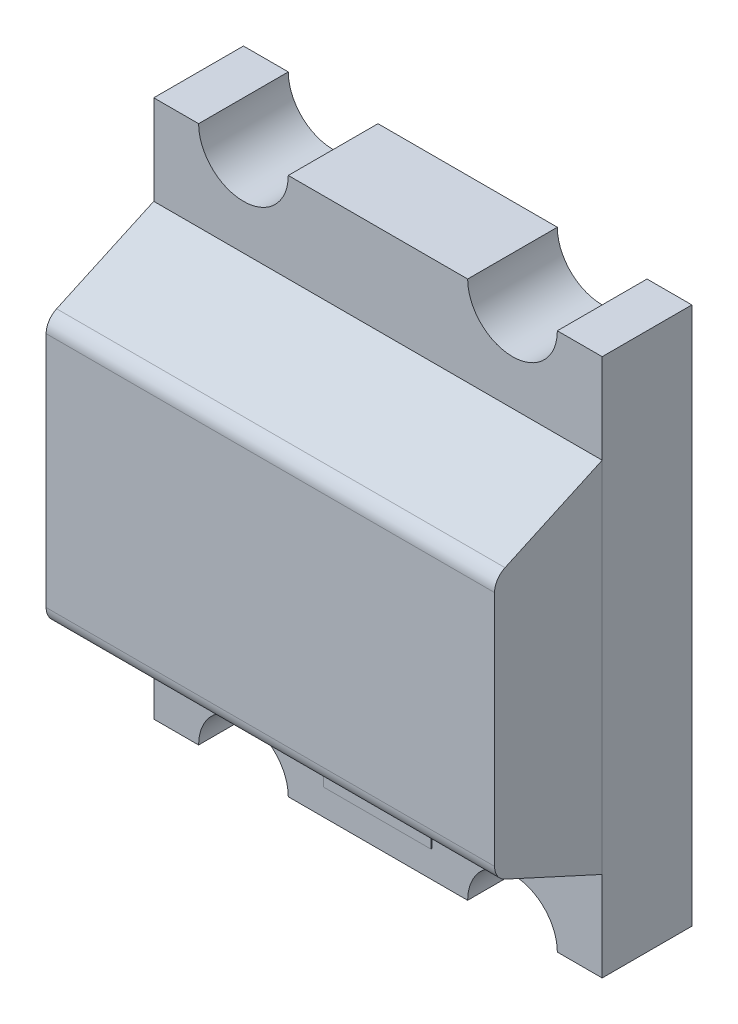
ISO-10303-21;
HEADER;
FILE_DESCRIPTION(('STEP AP214'),'2;1');
FILE_NAME('part.step','',(''),(''),'','','');
FILE_SCHEMA(('AUTOMOTIVE_DESIGN { 1 0 10303 214 1 1 1 1 }'));
ENDSEC;
DATA;
#1=APPLICATION_CONTEXT('core data for automotive mechanical design processes');
#2=APPLICATION_PROTOCOL_DEFINITION('international standard','automotive_design',2000,#1);
#3=PRODUCT_CONTEXT('',#1,'mechanical');
#4=PRODUCT('Part','Part','',(#3));
#5=PRODUCT_RELATED_PRODUCT_CATEGORY('part','',(#4));
#6=PRODUCT_DEFINITION_FORMATION('','',#4);
#7=PRODUCT_DEFINITION_CONTEXT('part definition',#1,'design');
#8=PRODUCT_DEFINITION('design','',#6,#7);
#9=PRODUCT_DEFINITION_SHAPE('','',#8);
#10=(LENGTH_UNIT() NAMED_UNIT(*) SI_UNIT(.MILLI.,.METRE.));
#11=(NAMED_UNIT(*) PLANE_ANGLE_UNIT() SI_UNIT($,.RADIAN.));
#12=(NAMED_UNIT(*) SI_UNIT($,.STERADIAN.) SOLID_ANGLE_UNIT());
#13=UNCERTAINTY_MEASURE_WITH_UNIT(LENGTH_MEASURE(1.E-05),#10,'distance_accuracy_value','');
#14=(GEOMETRIC_REPRESENTATION_CONTEXT(3) GLOBAL_UNCERTAINTY_ASSIGNED_CONTEXT((#13)) GLOBAL_UNIT_ASSIGNED_CONTEXT((#10,
#11,#12)) REPRESENTATION_CONTEXT('',''));
#15=CARTESIAN_POINT('',(0.,0.,0.));
#16=DIRECTION('',(0.,0.,1.));
#17=DIRECTION('',(1.,0.,0.));
#18=AXIS2_PLACEMENT_3D('',#15,#16,#17);
#19=CARTESIAN_POINT('',(0.,0.5,1.1));
#20=DIRECTION('',(0.,0.,1.));
#21=DIRECTION('',(1.,0.,0.));
#22=AXIS2_PLACEMENT_3D('',#19,#20,#21);
#23=PLANE('',#22);
#24=DIRECTION('',(0.,1.,0.));
#25=VECTOR('',#24,1.);
#26=CARTESIAN_POINT('',(2.5,0.5,1.1));
#27=LINE('',#26,#25);
#28=CARTESIAN_POINT('',(2.5,0.838900306603,1.1));
#29=VERTEX_POINT('',#28);
#30=CARTESIAN_POINT('',(2.5,2.161099693397,1.1));
#31=VERTEX_POINT('',#30);
#32=EDGE_CURVE('P0_E101',#29,#31,#27,.T.);
#33=ORIENTED_EDGE('',*,*,#32,.T.);
#34=DIRECTION('',(1.,0.,0.));
#35=VECTOR('',#34,1.);
#36=CARTESIAN_POINT('',(0.,2.161099693397,1.1));
#37=LINE('',#36,#35);
#38=CARTESIAN_POINT('',(0.,2.161099693397,1.1));
#39=VERTEX_POINT('',#38);
#40=EDGE_CURVE('P0_E25',#39,#31,#37,.T.);
#41=ORIENTED_EDGE('',*,*,#40,.F.);
#42=DIRECTION('',(0.,-1.,0.));
#43=VECTOR('',#42,1.);
#44=CARTESIAN_POINT('',(0.,0.5,1.1));
#45=LINE('',#44,#43);
#46=CARTESIAN_POINT('',(0.,0.838900306603,1.1));
#47=VERTEX_POINT('',#46);
#48=EDGE_CURVE('P0_E134',#39,#47,#45,.T.);
#49=ORIENTED_EDGE('',*,*,#48,.T.);
#50=DIRECTION('',(-1.,0.,0.));
#51=VECTOR('',#50,1.);
#52=CARTESIAN_POINT('',(0.,0.838900306603,1.1));
#53=LINE('',#52,#51);
#54=EDGE_CURVE('P0_E11',#29,#47,#53,.T.);
#55=ORIENTED_EDGE('',*,*,#54,.F.);
#56=EDGE_LOOP('',(#33,#41,#49,#55));
#57=FACE_BOUND('',#56,.T.);
#58=ADVANCED_FACE('P0_F17',(#57),#23,.T.);
#59=CARTESIAN_POINT('',(0.,0.838900306603,1.));
#60=DIRECTION('',(1.,0.,0.));
#61=DIRECTION('',(0.,0.,-1.));
#62=AXIS2_PLACEMENT_3D('',#59,#60,#61);
#63=CYLINDRICAL_SURFACE('',#62,0.1);
#64=ORIENTED_EDGE('',*,*,#54,.T.);
#65=CARTESIAN_POINT('',(0.,0.838900306603,1.));
#66=DIRECTION('',(1.,0.,0.));
#67=DIRECTION('',(0.,0.,-1.));
#68=AXIS2_PLACEMENT_3D('',#65,#66,#67);
#69=CIRCLE('',#68,0.1);
#70=CARTESIAN_POINT('',(0.,0.747976695697735,1.04162807922619));
#71=VERTEX_POINT('',#70);
#72=EDGE_CURVE('P0_E137',#47,#71,#69,.T.);
#73=ORIENTED_EDGE('',*,*,#72,.T.);
#74=DIRECTION('',(1.,0.,0.));
#75=VECTOR('',#74,1.);
#76=CARTESIAN_POINT('',(0.,0.747976695697709,1.04162807922613));
#77=LINE('',#76,#75);
#78=CARTESIAN_POINT('',(2.5,0.747976695697892,1.04162807922615));
#79=VERTEX_POINT('',#78);
#80=EDGE_CURVE('P0_E60',#71,#79,#77,.T.);
#81=ORIENTED_EDGE('',*,*,#80,.T.);
#82=CARTESIAN_POINT('',(2.5,0.838900306603,1.));
#83=DIRECTION('',(-1.,0.,0.));
#84=DIRECTION('',(0.,0.,-1.));
#85=AXIS2_PLACEMENT_3D('',#82,#83,#84);
#86=CIRCLE('',#85,0.1);
#87=EDGE_CURVE('P0_E131',#79,#29,#86,.T.);
#88=ORIENTED_EDGE('',*,*,#87,.T.);
#89=EDGE_LOOP('',(#64,#73,#81,#88));
#90=FACE_BOUND('',#89,.T.);
#91=ADVANCED_FACE('P0_F177',(#90),#63,.T.);
#92=CARTESIAN_POINT('',(0.,2.161099693397,1.));
#93=DIRECTION('',(1.,0.,0.));
#94=DIRECTION('',(0.,0.,-1.));
#95=AXIS2_PLACEMENT_3D('',#92,#93,#94);
#96=CYLINDRICAL_SURFACE('',#95,0.1);
#97=DIRECTION('',(1.,0.,0.));
#98=VECTOR('',#97,1.);
#99=CARTESIAN_POINT('',(0.,2.25202330430229,1.04162807922613));
#100=LINE('',#99,#98);
#101=CARTESIAN_POINT('',(0.,2.25202330430227,1.04162807922619));
#102=VERTEX_POINT('',#101);
#103=CARTESIAN_POINT('',(2.5,2.25202330430227,1.04162807922619));
#104=VERTEX_POINT('',#103);
#105=EDGE_CURVE('P0_E96',#102,#104,#100,.T.);
#106=ORIENTED_EDGE('',*,*,#105,.F.);
#107=CARTESIAN_POINT('',(0.,2.161099693397,1.));
#108=DIRECTION('',(1.,0.,0.));
#109=DIRECTION('',(0.,0.,-1.));
#110=AXIS2_PLACEMENT_3D('',#107,#108,#109);
#111=CIRCLE('',#110,0.1);
#112=EDGE_CURVE('P0_E86',#102,#39,#111,.T.);
#113=ORIENTED_EDGE('',*,*,#112,.T.);
#114=ORIENTED_EDGE('',*,*,#40,.T.);
#115=CARTESIAN_POINT('',(2.5,2.161099693397,1.));
#116=DIRECTION('',(1.,0.,0.));
#117=DIRECTION('',(0.,0.,-1.));
#118=AXIS2_PLACEMENT_3D('',#115,#116,#117);
#119=CIRCLE('',#118,0.1);
#120=EDGE_CURVE('P0_E92',#104,#31,#119,.T.);
#121=ORIENTED_EDGE('',*,*,#120,.F.);
#122=EDGE_LOOP('',(#106,#113,#114,#121));
#123=FACE_BOUND('',#122,.T.);
#124=ADVANCED_FACE('P0_F94',(#123),#96,.T.);
#125=CARTESIAN_POINT('',(0.,0.5,0.5));
#126=DIRECTION('',(1.,0.,0.));
#127=DIRECTION('',(0.,1.,0.));
#128=AXIS2_PLACEMENT_3D('',#125,#126,#127);
#129=PLANE('',#128);
#130=DIRECTION('',(0.,-0.416280792260095,0.909236109047209));
#131=VECTOR('',#130,1.);
#132=CARTESIAN_POINT('',(0.,2.5,0.5));
#133=LINE('',#132,#131);
#134=CARTESIAN_POINT('',(0.,2.5,0.5));
#135=VERTEX_POINT('',#134);
#136=EDGE_CURVE('P0_E115',#135,#102,#133,.T.);
#137=ORIENTED_EDGE('',*,*,#136,.F.);
#138=DIRECTION('',(0.,-1.,0.));
#139=VECTOR('',#138,1.);
#140=CARTESIAN_POINT('',(0.,0.5,0.5));
#141=LINE('',#140,#139);
#142=CARTESIAN_POINT('',(0.,0.5,0.5));
#143=VERTEX_POINT('',#142);
#144=EDGE_CURVE('P0_E157',#135,#143,#141,.T.);
#145=ORIENTED_EDGE('',*,*,#144,.T.);
#146=DIRECTION('',(0.,0.416280792260095,0.909236109047209));
#147=VECTOR('',#146,1.);
#148=CARTESIAN_POINT('',(0.,0.5,0.5));
#149=LINE('',#148,#147);
#150=EDGE_CURVE('P0_E126',#143,#71,#149,.T.);
#151=ORIENTED_EDGE('',*,*,#150,.T.);
#152=ORIENTED_EDGE('',*,*,#72,.F.);
#153=ORIENTED_EDGE('',*,*,#48,.F.);
#154=ORIENTED_EDGE('',*,*,#112,.F.);
#155=EDGE_LOOP('',(#137,#145,#151,#152,#153,#154));
#156=FACE_BOUND('',#155,.T.);
#157=ADVANCED_FACE('P0_F168',(#156),#129,.F.);
#158=CARTESIAN_POINT('',(0.,0.5,0.5));
#159=DIRECTION('',(0.,0.909236109047209,-0.416280792260095));
#160=DIRECTION('',(-1.,0.,0.));
#161=AXIS2_PLACEMENT_3D('',#158,#159,#160);
#162=PLANE('',#161);
#163=ORIENTED_EDGE('',*,*,#150,.F.);
#164=DIRECTION('',(1.,0.,0.));
#165=VECTOR('',#164,1.);
#166=CARTESIAN_POINT('',(0.,0.5,0.5));
#167=LINE('',#166,#165);
#168=CARTESIAN_POINT('',(2.5,0.5,0.5));
#169=VERTEX_POINT('',#168);
#170=EDGE_CURVE('P0_E153',#143,#169,#167,.T.);
#171=ORIENTED_EDGE('',*,*,#170,.T.);
#172=DIRECTION('',(0.,-0.416280792260584,-0.909236109046985));
#173=VECTOR('',#172,1.);
#174=CARTESIAN_POINT('',(2.5,0.747976695698,1.041628079226));
#175=LINE('',#174,#173);
#176=EDGE_CURVE('P0_E129',#79,#169,#175,.T.);
#177=ORIENTED_EDGE('',*,*,#176,.F.);
#178=ORIENTED_EDGE('',*,*,#80,.F.);
#179=EDGE_LOOP('',(#163,#171,#177,#178));
#180=FACE_BOUND('',#179,.T.);
#181=ADVANCED_FACE('P0_F173',(#180),#162,.F.);
#182=CARTESIAN_POINT('',(2.5,0.5,0.5));
#183=DIRECTION('',(1.,0.,0.));
#184=DIRECTION('',(0.,1.,0.));
#185=AXIS2_PLACEMENT_3D('',#182,#183,#184);
#186=PLANE('',#185);
#187=DIRECTION('',(0.,0.416280792260095,-0.909236109047209));
#188=VECTOR('',#187,1.);
#189=CARTESIAN_POINT('',(2.5,2.5,0.5));
#190=LINE('',#189,#188);
#191=CARTESIAN_POINT('',(2.5,2.5,0.5));
#192=VERTEX_POINT('',#191);
#193=EDGE_CURVE('P0_E102',#104,#192,#190,.T.);
#194=ORIENTED_EDGE('',*,*,#193,.F.);
#195=ORIENTED_EDGE('',*,*,#120,.T.);
#196=ORIENTED_EDGE('',*,*,#32,.F.);
#197=ORIENTED_EDGE('',*,*,#87,.F.);
#198=ORIENTED_EDGE('',*,*,#176,.T.);
#199=DIRECTION('',(0.,1.,0.));
#200=VECTOR('',#199,1.);
#201=CARTESIAN_POINT('',(2.5,0.5,0.5));
#202=LINE('',#201,#200);
#203=EDGE_CURVE('P0_E108',#169,#192,#202,.T.);
#204=ORIENTED_EDGE('',*,*,#203,.T.);
#205=EDGE_LOOP('',(#194,#195,#196,#197,#198,#204));
#206=FACE_BOUND('',#205,.T.);
#207=ADVANCED_FACE('P0_F105',(#206),#186,.T.);
#208=CARTESIAN_POINT('',(0.,2.5,0.5));
#209=DIRECTION('',(0.,0.909236109047209,0.416280792260095));
#210=DIRECTION('',(1.,0.,0.));
#211=AXIS2_PLACEMENT_3D('',#208,#209,#210);
#212=PLANE('',#211);
#213=ORIENTED_EDGE('',*,*,#136,.T.);
#214=ORIENTED_EDGE('',*,*,#105,.T.);
#215=ORIENTED_EDGE('',*,*,#193,.T.);
#216=DIRECTION('',(-1.,0.,0.));
#217=VECTOR('',#216,1.);
#218=CARTESIAN_POINT('',(0.,2.5,0.5));
#219=LINE('',#218,#217);
#220=EDGE_CURVE('P0_E122',#192,#135,#219,.T.);
#221=ORIENTED_EDGE('',*,*,#220,.T.);
#222=EDGE_LOOP('',(#213,#214,#215,#221));
#223=FACE_BOUND('',#222,.T.);
#224=ADVANCED_FACE('P0_F114',(#223),#212,.T.);
#225=CARTESIAN_POINT('',(0.,0.5,0.5));
#226=DIRECTION('',(0.,0.,1.));
#227=DIRECTION('',(1.,0.,0.));
#228=AXIS2_PLACEMENT_3D('',#225,#226,#227);
#229=PLANE('',#228);
#230=ORIENTED_EDGE('',*,*,#203,.F.);
#231=ORIENTED_EDGE('',*,*,#170,.F.);
#232=ORIENTED_EDGE('',*,*,#144,.F.);
#233=ORIENTED_EDGE('',*,*,#220,.F.);
#234=EDGE_LOOP('',(#230,#231,#232,#233));
#235=FACE_BOUND('',#234,.T.);
#236=ADVANCED_FACE('P0_F171',(#235),#229,.F.);
#237=CLOSED_SHELL('',(#58,#91,#124,#157,#181,#207,#224,#236));
#238=MANIFOLD_SOLID_BREP('P0_B1',#237);
#239=CARTESIAN_POINT('',(0.,0.,0.));
#240=DIRECTION('',(0.,0.,1.));
#241=DIRECTION('',(1.,0.,0.));
#242=AXIS2_PLACEMENT_3D('',#239,#240,#241);
#243=PLANE('',#242);
#244=DIRECTION('',(-1.,0.,0.));
#245=VECTOR('',#244,1.);
#246=CARTESIAN_POINT('',(0.,3.,0.));
#247=LINE('',#246,#245);
#248=CARTESIAN_POINT('',(1.75,3.,0.));
#249=VERTEX_POINT('',#248);
#250=CARTESIAN_POINT('',(0.75,3.,0.));
#251=VERTEX_POINT('',#250);
#252=EDGE_CURVE('P1_E156',#249,#251,#247,.T.);
#253=ORIENTED_EDGE('',*,*,#252,.F.);
#254=CARTESIAN_POINT('',(2.,3.,0.));
#255=DIRECTION('',(0.,0.,-1.));
#256=DIRECTION('',(1.,0.,0.));
#257=AXIS2_PLACEMENT_3D('',#254,#255,#256);
#258=CIRCLE('',#257,0.25);
#259=CARTESIAN_POINT('',(2.25,3.,0.));
#260=VERTEX_POINT('',#259);
#261=EDGE_CURVE('P1_E148',#260,#249,#258,.T.);
#262=ORIENTED_EDGE('',*,*,#261,.F.);
#263=DIRECTION('',(-1.,0.,0.));
#264=VECTOR('',#263,1.);
#265=CARTESIAN_POINT('',(0.,3.,0.));
#266=LINE('',#265,#264);
#267=CARTESIAN_POINT('',(2.5,3.,0.));
#268=VERTEX_POINT('',#267);
#269=EDGE_CURVE('P1_E133',#268,#260,#266,.T.);
#270=ORIENTED_EDGE('',*,*,#269,.F.);
#271=DIRECTION('',(0.,1.,0.));
#272=VECTOR('',#271,1.);
#273=CARTESIAN_POINT('',(2.5,0.,0.));
#274=LINE('',#273,#272);
#275=CARTESIAN_POINT('',(2.5,0.,0.));
#276=VERTEX_POINT('',#275);
#277=EDGE_CURVE('P1_E173',#276,#268,#274,.T.);
#278=ORIENTED_EDGE('',*,*,#277,.F.);
#279=DIRECTION('',(-1.,0.,0.));
#280=VECTOR('',#279,1.);
#281=CARTESIAN_POINT('',(0.,0.,0.));
#282=LINE('',#281,#280);
#283=CARTESIAN_POINT('',(2.25,0.,0.));
#284=VERTEX_POINT('',#283);
#285=EDGE_CURVE('P1_E183',#276,#284,#282,.T.);
#286=ORIENTED_EDGE('',*,*,#285,.T.);
#287=CARTESIAN_POINT('',(2.,0.,0.));
#288=DIRECTION('',(0.,0.,1.));
#289=DIRECTION('',(1.,0.,0.));
#290=AXIS2_PLACEMENT_3D('',#287,#288,#289);
#291=CIRCLE('',#290,0.25);
#292=CARTESIAN_POINT('',(1.75,0.,0.));
#293=VERTEX_POINT('',#292);
#294=EDGE_CURVE('P1_E187',#284,#293,#291,.T.);
#295=ORIENTED_EDGE('',*,*,#294,.T.);
#296=DIRECTION('',(-1.,0.,0.));
#297=VECTOR('',#296,1.);
#298=CARTESIAN_POINT('',(0.,0.,0.));
#299=LINE('',#298,#297);
#300=CARTESIAN_POINT('',(0.75,0.,0.));
#301=VERTEX_POINT('',#300);
#302=EDGE_CURVE('P1_E182',#293,#301,#299,.T.);
#303=ORIENTED_EDGE('',*,*,#302,.T.);
#304=CARTESIAN_POINT('',(0.5,0.,0.));
#305=DIRECTION('',(0.,0.,1.));
#306=DIRECTION('',(1.,0.,0.));
#307=AXIS2_PLACEMENT_3D('',#304,#305,#306);
#308=CIRCLE('',#307,0.25);
#309=CARTESIAN_POINT('',(0.25,0.,0.));
#310=VERTEX_POINT('',#309);
#311=EDGE_CURVE('P1_E177',#301,#310,#308,.T.);
#312=ORIENTED_EDGE('',*,*,#311,.T.);
#313=DIRECTION('',(-1.,0.,0.));
#314=VECTOR('',#313,1.);
#315=CARTESIAN_POINT('',(0.,0.,0.));
#316=LINE('',#315,#314);
#317=CARTESIAN_POINT('',(0.,0.,0.));
#318=VERTEX_POINT('',#317);
#319=EDGE_CURVE('P1_E201',#310,#318,#316,.T.);
#320=ORIENTED_EDGE('',*,*,#319,.T.);
#321=DIRECTION('',(0.,1.,0.));
#322=VECTOR('',#321,1.);
#323=CARTESIAN_POINT('',(0.,0.,0.));
#324=LINE('',#323,#322);
#325=CARTESIAN_POINT('',(0.,3.,0.));
#326=VERTEX_POINT('',#325);
#327=EDGE_CURVE('P1_E25',#318,#326,#324,.T.);
#328=ORIENTED_EDGE('',*,*,#327,.T.);
#329=DIRECTION('',(-1.,0.,0.));
#330=VECTOR('',#329,1.);
#331=CARTESIAN_POINT('',(0.,3.,0.));
#332=LINE('',#331,#330);
#333=CARTESIAN_POINT('',(0.25,3.,0.));
#334=VERTEX_POINT('',#333);
#335=EDGE_CURVE('P1_E10',#334,#326,#332,.T.);
#336=ORIENTED_EDGE('',*,*,#335,.F.);
#337=CARTESIAN_POINT('',(0.5,3.,0.));
#338=DIRECTION('',(0.,0.,-1.));
#339=DIRECTION('',(1.,0.,0.));
#340=AXIS2_PLACEMENT_3D('',#337,#338,#339);
#341=CIRCLE('',#340,0.25);
#342=EDGE_CURVE('P1_E272',#251,#334,#341,.T.);
#343=ORIENTED_EDGE('',*,*,#342,.F.);
#344=EDGE_LOOP('',(#253,#262,#270,#278,#286,#295,#303,#312,#320,#328,#336,#343));
#345=FACE_BOUND('',#344,.T.);
#346=ADVANCED_FACE('P1_F16',(#345),#243,.F.);
#347=CARTESIAN_POINT('',(0.,3.,0.));
#348=DIRECTION('',(0.,1.,0.));
#349=DIRECTION('',(1.,0.,0.));
#350=AXIS2_PLACEMENT_3D('',#347,#348,#349);
#351=PLANE('',#350);
#352=DIRECTION('',(-1.,0.,0.));
#353=VECTOR('',#352,1.);
#354=CARTESIAN_POINT('',(0.,3.,0.5));
#355=LINE('',#354,#353);
#356=CARTESIAN_POINT('',(0.25,3.,0.5));
#357=VERTEX_POINT('',#356);
#358=CARTESIAN_POINT('',(0.,3.,0.5));
#359=VERTEX_POINT('',#358);
#360=EDGE_CURVE('P1_E216',#357,#359,#355,.T.);
#361=ORIENTED_EDGE('',*,*,#360,.F.);
#362=DIRECTION('',(0.,0.,-1.));
#363=VECTOR('',#362,1.);
#364=CARTESIAN_POINT('',(0.25,3.,0.5));
#365=LINE('',#364,#363);
#366=EDGE_CURVE('P1_E218',#357,#334,#365,.T.);
#367=ORIENTED_EDGE('',*,*,#366,.T.);
#368=ORIENTED_EDGE('',*,*,#335,.T.);
#369=DIRECTION('',(0.,0.,1.));
#370=VECTOR('',#369,1.);
#371=CARTESIAN_POINT('',(0.,3.,0.));
#372=LINE('',#371,#370);
#373=EDGE_CURVE('P1_E204',#326,#359,#372,.T.);
#374=ORIENTED_EDGE('',*,*,#373,.T.);
#375=EDGE_LOOP('',(#361,#367,#368,#374));
#376=FACE_BOUND('',#375,.T.);
#377=ADVANCED_FACE('P1_F215',(#376),#351,.T.);
#378=CARTESIAN_POINT('',(0.,0.,0.));
#379=DIRECTION('',(1.,0.,0.));
#380=DIRECTION('',(0.,1.,0.));
#381=AXIS2_PLACEMENT_3D('',#378,#379,#380);
#382=PLANE('',#381);
#383=ORIENTED_EDGE('',*,*,#373,.F.);
#384=ORIENTED_EDGE('',*,*,#327,.F.);
#385=DIRECTION('',(0.,0.,1.));
#386=VECTOR('',#385,1.);
#387=CARTESIAN_POINT('',(0.,0.,0.));
#388=LINE('',#387,#386);
#389=CARTESIAN_POINT('',(0.,0.,0.5));
#390=VERTEX_POINT('',#389);
#391=EDGE_CURVE('P1_E200',#318,#390,#388,.T.);
#392=ORIENTED_EDGE('',*,*,#391,.T.);
#393=DIRECTION('',(0.,-1.,0.));
#394=VECTOR('',#393,1.);
#395=CARTESIAN_POINT('',(0.,0.,0.5));
#396=LINE('',#395,#394);
#397=EDGE_CURVE('P1_E212',#359,#390,#396,.T.);
#398=ORIENTED_EDGE('',*,*,#397,.F.);
#399=EDGE_LOOP('',(#383,#384,#392,#398));
#400=FACE_BOUND('',#399,.T.);
#401=ADVANCED_FACE('P1_F18',(#400),#382,.F.);
#402=CARTESIAN_POINT('',(0.,0.,0.));
#403=DIRECTION('',(0.,1.,0.));
#404=DIRECTION('',(1.,0.,0.));
#405=AXIS2_PLACEMENT_3D('',#402,#403,#404);
#406=PLANE('',#405);
#407=DIRECTION('',(1.,0.,0.));
#408=VECTOR('',#407,1.);
#409=CARTESIAN_POINT('',(0.,0.,0.5));
#410=LINE('',#409,#408);
#411=CARTESIAN_POINT('',(0.25,0.,0.5));
#412=VERTEX_POINT('',#411);
#413=EDGE_CURVE('P1_E239',#390,#412,#410,.T.);
#414=ORIENTED_EDGE('',*,*,#413,.F.);
#415=ORIENTED_EDGE('',*,*,#391,.F.);
#416=ORIENTED_EDGE('',*,*,#319,.F.);
#417=DIRECTION('',(0.,0.,1.));
#418=VECTOR('',#417,1.);
#419=CARTESIAN_POINT('',(0.25,0.,0.5));
#420=LINE('',#419,#418);
#421=EDGE_CURVE('P1_E181',#310,#412,#420,.T.);
#422=ORIENTED_EDGE('',*,*,#421,.T.);
#423=EDGE_LOOP('',(#414,#415,#416,#422));
#424=FACE_BOUND('',#423,.T.);
#425=ADVANCED_FACE('P1_F297',(#424),#406,.F.);
#426=CARTESIAN_POINT('',(0.5,0.,0.5));
#427=DIRECTION('',(0.,0.,1.));
#428=DIRECTION('',(1.,0.,0.));
#429=AXIS2_PLACEMENT_3D('',#426,#427,#428);
#430=CYLINDRICAL_SURFACE('',#429,0.25);
#431=ORIENTED_EDGE('',*,*,#311,.F.);
#432=DIRECTION('',(0.,0.,1.));
#433=VECTOR('',#432,1.);
#434=CARTESIAN_POINT('',(0.75,0.,0.));
#435=LINE('',#434,#433);
#436=CARTESIAN_POINT('',(0.75,0.,0.5));
#437=VERTEX_POINT('',#436);
#438=EDGE_CURVE('P1_E194',#301,#437,#435,.T.);
#439=ORIENTED_EDGE('',*,*,#438,.T.);
#440=CARTESIAN_POINT('',(0.5,0.,0.5));
#441=DIRECTION('',(0.,0.,-1.));
#442=DIRECTION('',(1.,0.,0.));
#443=AXIS2_PLACEMENT_3D('',#440,#441,#442);
#444=CIRCLE('',#443,0.25);
#445=EDGE_CURVE('P1_E250',#412,#437,#444,.T.);
#446=ORIENTED_EDGE('',*,*,#445,.F.);
#447=ORIENTED_EDGE('',*,*,#421,.F.);
#448=EDGE_LOOP('',(#431,#439,#446,#447));
#449=FACE_BOUND('',#448,.T.);
#450=ADVANCED_FACE('P1_F300',(#449),#430,.F.);
#451=CARTESIAN_POINT('',(0.,0.,0.));
#452=DIRECTION('',(0.,1.,0.));
#453=DIRECTION('',(1.,0.,0.));
#454=AXIS2_PLACEMENT_3D('',#451,#452,#453);
#455=PLANE('',#454);
#456=DIRECTION('',(1.,0.,0.));
#457=VECTOR('',#456,1.);
#458=CARTESIAN_POINT('',(0.,0.,0.5));
#459=LINE('',#458,#457);
#460=CARTESIAN_POINT('',(1.75,0.,0.5));
#461=VERTEX_POINT('',#460);
#462=EDGE_CURVE('P1_E245',#437,#461,#459,.T.);
#463=ORIENTED_EDGE('',*,*,#462,.F.);
#464=ORIENTED_EDGE('',*,*,#438,.F.);
#465=ORIENTED_EDGE('',*,*,#302,.F.);
#466=DIRECTION('',(0.,0.,1.));
#467=VECTOR('',#466,1.);
#468=CARTESIAN_POINT('',(1.75,0.,0.5));
#469=LINE('',#468,#467);
#470=EDGE_CURVE('P1_E191',#293,#461,#469,.T.);
#471=ORIENTED_EDGE('',*,*,#470,.T.);
#472=EDGE_LOOP('',(#463,#464,#465,#471));
#473=FACE_BOUND('',#472,.T.);
#474=ADVANCED_FACE('P1_F304',(#473),#455,.F.);
#475=CARTESIAN_POINT('',(2.,0.,0.5));
#476=DIRECTION('',(0.,0.,1.));
#477=DIRECTION('',(1.,0.,0.));
#478=AXIS2_PLACEMENT_3D('',#475,#476,#477);
#479=CYLINDRICAL_SURFACE('',#478,0.25);
#480=ORIENTED_EDGE('',*,*,#294,.F.);
#481=DIRECTION('',(0.,0.,1.));
#482=VECTOR('',#481,1.);
#483=CARTESIAN_POINT('',(2.25,0.,0.));
#484=LINE('',#483,#482);
#485=CARTESIAN_POINT('',(2.25,0.,0.5));
#486=VERTEX_POINT('',#485);
#487=EDGE_CURVE('P1_E176',#284,#486,#484,.T.);
#488=ORIENTED_EDGE('',*,*,#487,.T.);
#489=CARTESIAN_POINT('',(2.,0.,0.5));
#490=DIRECTION('',(0.,0.,-1.));
#491=DIRECTION('',(1.,0.,0.));
#492=AXIS2_PLACEMENT_3D('',#489,#490,#491);
#493=CIRCLE('',#492,0.25);
#494=EDGE_CURVE('P1_E249',#461,#486,#493,.T.);
#495=ORIENTED_EDGE('',*,*,#494,.F.);
#496=ORIENTED_EDGE('',*,*,#470,.F.);
#497=EDGE_LOOP('',(#480,#488,#495,#496));
#498=FACE_BOUND('',#497,.T.);
#499=ADVANCED_FACE('P1_F309',(#498),#479,.F.);
#500=CARTESIAN_POINT('',(0.,0.,0.));
#501=DIRECTION('',(0.,1.,0.));
#502=DIRECTION('',(1.,0.,0.));
#503=AXIS2_PLACEMENT_3D('',#500,#501,#502);
#504=PLANE('',#503);
#505=DIRECTION('',(1.,0.,0.));
#506=VECTOR('',#505,1.);
#507=CARTESIAN_POINT('',(0.,0.,0.5));
#508=LINE('',#507,#506);
#509=CARTESIAN_POINT('',(2.5,0.,0.5));
#510=VERTEX_POINT('',#509);
#511=EDGE_CURVE('P1_E254',#486,#510,#508,.T.);
#512=ORIENTED_EDGE('',*,*,#511,.F.);
#513=ORIENTED_EDGE('',*,*,#487,.F.);
#514=ORIENTED_EDGE('',*,*,#285,.F.);
#515=DIRECTION('',(0.,0.,-1.));
#516=VECTOR('',#515,1.);
#517=CARTESIAN_POINT('',(2.5,0.,0.));
#518=LINE('',#517,#516);
#519=EDGE_CURVE('P1_E144',#510,#276,#518,.T.);
#520=ORIENTED_EDGE('',*,*,#519,.F.);
#521=EDGE_LOOP('',(#512,#513,#514,#520));
#522=FACE_BOUND('',#521,.T.);
#523=ADVANCED_FACE('P1_F312',(#522),#504,.F.);
#524=CARTESIAN_POINT('',(2.5,0.,0.));
#525=DIRECTION('',(1.,0.,0.));
#526=DIRECTION('',(0.,1.,0.));
#527=AXIS2_PLACEMENT_3D('',#524,#525,#526);
#528=PLANE('',#527);
#529=DIRECTION('',(0.,0.,-1.));
#530=VECTOR('',#529,1.);
#531=CARTESIAN_POINT('',(2.5,3.,0.));
#532=LINE('',#531,#530);
#533=CARTESIAN_POINT('',(2.5,3.,0.5));
#534=VERTEX_POINT('',#533);
#535=EDGE_CURVE('P1_E139',#534,#268,#532,.T.);
#536=ORIENTED_EDGE('',*,*,#535,.F.);
#537=DIRECTION('',(0.,1.,0.));
#538=VECTOR('',#537,1.);
#539=CARTESIAN_POINT('',(2.5,0.,0.5));
#540=LINE('',#539,#538);
#541=EDGE_CURVE('P1_E260',#510,#534,#540,.T.);
#542=ORIENTED_EDGE('',*,*,#541,.F.);
#543=ORIENTED_EDGE('',*,*,#519,.T.);
#544=ORIENTED_EDGE('',*,*,#277,.T.);
#545=EDGE_LOOP('',(#536,#542,#543,#544));
#546=FACE_BOUND('',#545,.T.);
#547=ADVANCED_FACE('P1_F315',(#546),#528,.T.);
#548=CARTESIAN_POINT('',(0.,3.,0.));
#549=DIRECTION('',(0.,1.,0.));
#550=DIRECTION('',(1.,0.,0.));
#551=AXIS2_PLACEMENT_3D('',#548,#549,#550);
#552=PLANE('',#551);
#553=DIRECTION('',(-1.,0.,0.));
#554=VECTOR('',#553,1.);
#555=CARTESIAN_POINT('',(0.,3.,0.5));
#556=LINE('',#555,#554);
#557=CARTESIAN_POINT('',(2.25,3.,0.5));
#558=VERTEX_POINT('',#557);
#559=EDGE_CURVE('P1_E257',#534,#558,#556,.T.);
#560=ORIENTED_EDGE('',*,*,#559,.F.);
#561=ORIENTED_EDGE('',*,*,#535,.T.);
#562=ORIENTED_EDGE('',*,*,#269,.T.);
#563=DIRECTION('',(0.,0.,1.));
#564=VECTOR('',#563,1.);
#565=CARTESIAN_POINT('',(2.25,3.,0.5));
#566=LINE('',#565,#564);
#567=EDGE_CURVE('P1_E137',#260,#558,#566,.T.);
#568=ORIENTED_EDGE('',*,*,#567,.T.);
#569=EDGE_LOOP('',(#560,#561,#562,#568));
#570=FACE_BOUND('',#569,.T.);
#571=ADVANCED_FACE('P1_F136',(#570),#552,.T.);
#572=CARTESIAN_POINT('',(2.,3.,0.5));
#573=DIRECTION('',(0.,0.,1.));
#574=DIRECTION('',(1.,0.,0.));
#575=AXIS2_PLACEMENT_3D('',#572,#573,#574);
#576=CYLINDRICAL_SURFACE('',#575,0.25);
#577=ORIENTED_EDGE('',*,*,#261,.T.);
#578=DIRECTION('',(0.,0.,-1.));
#579=VECTOR('',#578,1.);
#580=CARTESIAN_POINT('',(1.75,3.,0.));
#581=LINE('',#580,#579);
#582=CARTESIAN_POINT('',(1.75,3.,0.5));
#583=VERTEX_POINT('',#582);
#584=EDGE_CURVE('P1_E164',#583,#249,#581,.T.);
#585=ORIENTED_EDGE('',*,*,#584,.F.);
#586=CARTESIAN_POINT('',(2.,3.,0.5));
#587=DIRECTION('',(0.,0.,-1.));
#588=DIRECTION('',(1.,0.,0.));
#589=AXIS2_PLACEMENT_3D('',#586,#587,#588);
#590=CIRCLE('',#589,0.25);
#591=EDGE_CURVE('P1_E151',#558,#583,#590,.T.);
#592=ORIENTED_EDGE('',*,*,#591,.F.);
#593=ORIENTED_EDGE('',*,*,#567,.F.);
#594=EDGE_LOOP('',(#577,#585,#592,#593));
#595=FACE_BOUND('',#594,.T.);
#596=ADVANCED_FACE('P1_F147',(#595),#576,.F.);
#597=CARTESIAN_POINT('',(0.,3.,0.));
#598=DIRECTION('',(0.,1.,0.));
#599=DIRECTION('',(1.,0.,0.));
#600=AXIS2_PLACEMENT_3D('',#597,#598,#599);
#601=PLANE('',#600);
#602=DIRECTION('',(-1.,0.,0.));
#603=VECTOR('',#602,1.);
#604=CARTESIAN_POINT('',(0.,3.,0.5));
#605=LINE('',#604,#603);
#606=CARTESIAN_POINT('',(0.75,3.,0.5));
#607=VERTEX_POINT('',#606);
#608=EDGE_CURVE('P1_E228',#583,#607,#605,.T.);
#609=ORIENTED_EDGE('',*,*,#608,.F.);
#610=ORIENTED_EDGE('',*,*,#584,.T.);
#611=ORIENTED_EDGE('',*,*,#252,.T.);
#612=DIRECTION('',(0.,0.,1.));
#613=VECTOR('',#612,1.);
#614=CARTESIAN_POINT('',(0.75,3.,0.5));
#615=LINE('',#614,#613);
#616=EDGE_CURVE('P1_E266',#251,#607,#615,.T.);
#617=ORIENTED_EDGE('',*,*,#616,.T.);
#618=EDGE_LOOP('',(#609,#610,#611,#617));
#619=FACE_BOUND('',#618,.T.);
#620=ADVANCED_FACE('P1_F278',(#619),#601,.T.);
#621=CARTESIAN_POINT('',(0.5,3.,0.5));
#622=DIRECTION('',(0.,0.,1.));
#623=DIRECTION('',(1.,0.,0.));
#624=AXIS2_PLACEMENT_3D('',#621,#622,#623);
#625=CYLINDRICAL_SURFACE('',#624,0.25);
#626=ORIENTED_EDGE('',*,*,#342,.T.);
#627=ORIENTED_EDGE('',*,*,#366,.F.);
#628=CARTESIAN_POINT('',(0.5,3.,0.5));
#629=DIRECTION('',(0.,0.,-1.));
#630=DIRECTION('',(1.,0.,0.));
#631=AXIS2_PLACEMENT_3D('',#628,#629,#630);
#632=CIRCLE('',#631,0.25);
#633=EDGE_CURVE('P1_E222',#607,#357,#632,.T.);
#634=ORIENTED_EDGE('',*,*,#633,.F.);
#635=ORIENTED_EDGE('',*,*,#616,.F.);
#636=EDGE_LOOP('',(#626,#627,#634,#635));
#637=FACE_BOUND('',#636,.T.);
#638=ADVANCED_FACE('P1_F279',(#637),#625,.F.);
#639=CARTESIAN_POINT('',(0.,0.,0.5));
#640=DIRECTION('',(0.,0.,1.));
#641=DIRECTION('',(1.,0.,0.));
#642=AXIS2_PLACEMENT_3D('',#639,#640,#641);
#643=PLANE('',#642);
#644=ORIENTED_EDGE('',*,*,#608,.T.);
#645=ORIENTED_EDGE('',*,*,#633,.T.);
#646=ORIENTED_EDGE('',*,*,#360,.T.);
#647=ORIENTED_EDGE('',*,*,#397,.T.);
#648=ORIENTED_EDGE('',*,*,#413,.T.);
#649=ORIENTED_EDGE('',*,*,#445,.T.);
#650=ORIENTED_EDGE('',*,*,#462,.T.);
#651=ORIENTED_EDGE('',*,*,#494,.T.);
#652=ORIENTED_EDGE('',*,*,#511,.T.);
#653=ORIENTED_EDGE('',*,*,#541,.T.);
#654=ORIENTED_EDGE('',*,*,#559,.T.);
#655=ORIENTED_EDGE('',*,*,#591,.T.);
#656=EDGE_LOOP('',(#644,#645,#646,#647,#648,#649,#650,#651,#652,#653,#654,#655));
#657=FACE_BOUND('',#656,.T.);
#658=ADVANCED_FACE('P1_F226',(#657),#643,.T.);
#659=CLOSED_SHELL('',(#346,#377,#401,#425,#450,#474,#499,#523,#547,#571,#596,#620,#638,#658));
#660=MANIFOLD_SOLID_BREP('P1_B1',#659);
#661=CARTESIAN_POINT('',(0.95,0.15,0.505));
#662=DIRECTION('',(0.,0.,1.));
#663=DIRECTION('',(1.,0.,0.));
#664=AXIS2_PLACEMENT_3D('',#661,#662,#663);
#665=PLANE('',#664);
#666=DIRECTION('',(0.,-1.,0.));
#667=VECTOR('',#666,1.);
#668=CARTESIAN_POINT('',(1.55,0.15,0.505));
#669=LINE('',#668,#667);
#670=CARTESIAN_POINT('',(1.55,0.5,0.505));
#671=VERTEX_POINT('',#670);
#672=CARTESIAN_POINT('',(1.55,0.15,0.505));
#673=VERTEX_POINT('',#672);
#674=EDGE_CURVE('P2_E75',#671,#673,#669,.T.);
#675=ORIENTED_EDGE('',*,*,#674,.F.);
#676=DIRECTION('',(1.,0.,0.));
#677=VECTOR('',#676,1.);
#678=CARTESIAN_POINT('',(0.95,0.5,0.505));
#679=LINE('',#678,#677);
#680=CARTESIAN_POINT('',(0.95,0.5,0.505));
#681=VERTEX_POINT('',#680);
#682=EDGE_CURVE('P2_E104',#681,#671,#679,.T.);
#683=ORIENTED_EDGE('',*,*,#682,.F.);
#684=DIRECTION('',(0.,-1.,0.));
#685=VECTOR('',#684,1.);
#686=CARTESIAN_POINT('',(0.95,0.15,0.505));
#687=LINE('',#686,#685);
#688=CARTESIAN_POINT('',(0.95,0.15,0.505));
#689=VERTEX_POINT('',#688);
#690=EDGE_CURVE('P2_E11',#681,#689,#687,.T.);
#691=ORIENTED_EDGE('',*,*,#690,.T.);
#692=DIRECTION('',(1.,0.,0.));
#693=VECTOR('',#692,1.);
#694=CARTESIAN_POINT('',(0.95,0.15,0.505));
#695=LINE('',#694,#693);
#696=EDGE_CURVE('P2_E42',#689,#673,#695,.T.);
#697=ORIENTED_EDGE('',*,*,#696,.T.);
#698=EDGE_LOOP('',(#675,#683,#691,#697));
#699=FACE_BOUND('',#698,.T.);
#700=ADVANCED_FACE('P2_F17',(#699),#665,.T.);
#701=CARTESIAN_POINT('',(0.95,0.15,0.5));
#702=DIRECTION('',(1.,0.,0.));
#703=DIRECTION('',(0.,1.,0.));
#704=AXIS2_PLACEMENT_3D('',#701,#702,#703);
#705=PLANE('',#704);
#706=DIRECTION('',(0.,0.,1.));
#707=VECTOR('',#706,1.);
#708=CARTESIAN_POINT('',(0.95,0.5,0.5));
#709=LINE('',#708,#707);
#710=CARTESIAN_POINT('',(0.95,0.5,0.5));
#711=VERTEX_POINT('',#710);
#712=EDGE_CURVE('P2_E111',#711,#681,#709,.T.);
#713=ORIENTED_EDGE('',*,*,#712,.F.);
#714=DIRECTION('',(0.,-1.,0.));
#715=VECTOR('',#714,1.);
#716=CARTESIAN_POINT('',(0.95,0.15,0.5));
#717=LINE('',#716,#715);
#718=CARTESIAN_POINT('',(0.95,0.15,0.5));
#719=VERTEX_POINT('',#718);
#720=EDGE_CURVE('P2_E86',#711,#719,#717,.T.);
#721=ORIENTED_EDGE('',*,*,#720,.T.);
#722=DIRECTION('',(0.,0.,1.));
#723=VECTOR('',#722,1.);
#724=CARTESIAN_POINT('',(0.95,0.15,0.5));
#725=LINE('',#724,#723);
#726=EDGE_CURVE('P2_E25',#719,#689,#725,.T.);
#727=ORIENTED_EDGE('',*,*,#726,.T.);
#728=ORIENTED_EDGE('',*,*,#690,.F.);
#729=EDGE_LOOP('',(#713,#721,#727,#728));
#730=FACE_BOUND('',#729,.T.);
#731=ADVANCED_FACE('P2_F191',(#730),#705,.F.);
#732=CARTESIAN_POINT('',(0.95,0.15,0.5));
#733=DIRECTION('',(0.,1.,0.));
#734=DIRECTION('',(1.,0.,0.));
#735=AXIS2_PLACEMENT_3D('',#732,#733,#734);
#736=PLANE('',#735);
#737=ORIENTED_EDGE('',*,*,#696,.F.);
#738=ORIENTED_EDGE('',*,*,#726,.F.);
#739=DIRECTION('',(1.,0.,0.));
#740=VECTOR('',#739,1.);
#741=CARTESIAN_POINT('',(0.95,0.15,0.5));
#742=LINE('',#741,#740);
#743=CARTESIAN_POINT('',(1.55,0.15,0.5));
#744=VERTEX_POINT('',#743);
#745=EDGE_CURVE('P2_E80',#719,#744,#742,.T.);
#746=ORIENTED_EDGE('',*,*,#745,.T.);
#747=DIRECTION('',(0.,0.,-1.));
#748=VECTOR('',#747,1.);
#749=CARTESIAN_POINT('',(1.55,0.15,0.5));
#750=LINE('',#749,#748);
#751=EDGE_CURVE('P2_E69',#673,#744,#750,.T.);
#752=ORIENTED_EDGE('',*,*,#751,.F.);
#753=EDGE_LOOP('',(#737,#738,#746,#752));
#754=FACE_BOUND('',#753,.T.);
#755=ADVANCED_FACE('P2_F81',(#754),#736,.F.);
#756=CARTESIAN_POINT('',(1.55,0.15,0.5));
#757=DIRECTION('',(1.,0.,0.));
#758=DIRECTION('',(0.,1.,0.));
#759=AXIS2_PLACEMENT_3D('',#756,#757,#758);
#760=PLANE('',#759);
#761=DIRECTION('',(0.,0.,-1.));
#762=VECTOR('',#761,1.);
#763=CARTESIAN_POINT('',(1.55,0.5,0.5));
#764=LINE('',#763,#762);
#765=CARTESIAN_POINT('',(1.55,0.5,0.5));
#766=VERTEX_POINT('',#765);
#767=EDGE_CURVE('P2_E108',#671,#766,#764,.T.);
#768=ORIENTED_EDGE('',*,*,#767,.F.);
#769=ORIENTED_EDGE('',*,*,#674,.T.);
#770=ORIENTED_EDGE('',*,*,#751,.T.);
#771=DIRECTION('',(0.,1.,0.));
#772=VECTOR('',#771,1.);
#773=CARTESIAN_POINT('',(1.55,0.15,0.5));
#774=LINE('',#773,#772);
#775=EDGE_CURVE('P2_E74',#744,#766,#774,.T.);
#776=ORIENTED_EDGE('',*,*,#775,.T.);
#777=EDGE_LOOP('',(#768,#769,#770,#776));
#778=FACE_BOUND('',#777,.T.);
#779=ADVANCED_FACE('P2_F72',(#778),#760,.T.);
#780=CARTESIAN_POINT('',(0.95,0.5,0.5));
#781=DIRECTION('',(0.,1.,0.));
#782=DIRECTION('',(1.,0.,0.));
#783=AXIS2_PLACEMENT_3D('',#780,#781,#782);
#784=PLANE('',#783);
#785=ORIENTED_EDGE('',*,*,#682,.T.);
#786=ORIENTED_EDGE('',*,*,#767,.T.);
#787=DIRECTION('',(-1.,0.,0.));
#788=VECTOR('',#787,1.);
#789=CARTESIAN_POINT('',(0.95,0.5,0.5));
#790=LINE('',#789,#788);
#791=EDGE_CURVE('P2_E91',#766,#711,#790,.T.);
#792=ORIENTED_EDGE('',*,*,#791,.T.);
#793=ORIENTED_EDGE('',*,*,#712,.T.);
#794=EDGE_LOOP('',(#785,#786,#792,#793));
#795=FACE_BOUND('',#794,.T.);
#796=ADVANCED_FACE('P2_F160',(#795),#784,.T.);
#797=CARTESIAN_POINT('',(0.95,0.15,0.5));
#798=DIRECTION('',(0.,0.,1.));
#799=DIRECTION('',(1.,0.,0.));
#800=AXIS2_PLACEMENT_3D('',#797,#798,#799);
#801=PLANE('',#800);
#802=ORIENTED_EDGE('',*,*,#775,.F.);
#803=ORIENTED_EDGE('',*,*,#745,.F.);
#804=ORIENTED_EDGE('',*,*,#720,.F.);
#805=ORIENTED_EDGE('',*,*,#791,.F.);
#806=EDGE_LOOP('',(#802,#803,#804,#805));
#807=FACE_BOUND('',#806,.T.);
#808=ADVANCED_FACE('P2_F89',(#807),#801,.F.);
#809=CLOSED_SHELL('',(#700,#731,#755,#779,#796,#808));
#810=MANIFOLD_SOLID_BREP('P2_B1',#809);
#811=ADVANCED_BREP_SHAPE_REPRESENTATION('',(#18,#238,#660,#810),#14);
#812=SHAPE_DEFINITION_REPRESENTATION(#9,#811);
ENDSEC;
END-ISO-10303-21;
